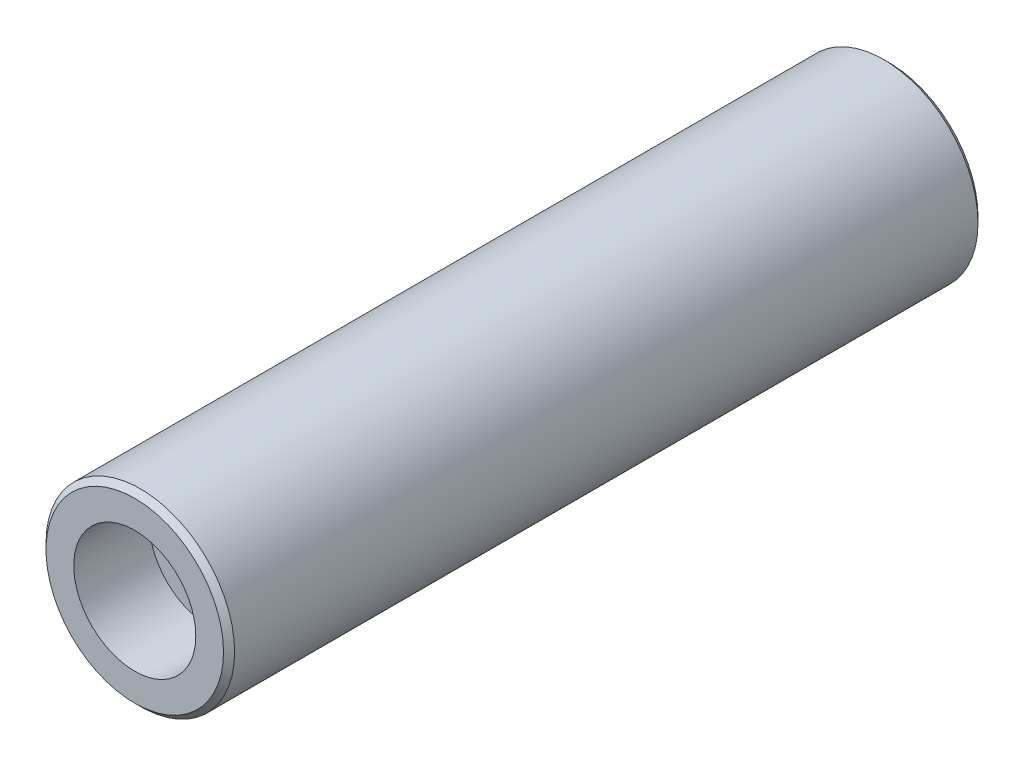
ISO-10303-21;
HEADER;
FILE_DESCRIPTION(('STEP AP214'),'2;1');
FILE_NAME('part.step','',(''),(''),'','','');
FILE_SCHEMA(('AUTOMOTIVE_DESIGN { 1 0 10303 214 1 1 1 1 }'));
ENDSEC;
DATA;
#1=APPLICATION_CONTEXT('core data for automotive mechanical design processes');
#2=APPLICATION_PROTOCOL_DEFINITION('international standard','automotive_design',2000,#1);
#3=PRODUCT_CONTEXT('',#1,'mechanical');
#4=PRODUCT('Part','Part','',(#3));
#5=PRODUCT_RELATED_PRODUCT_CATEGORY('part','',(#4));
#6=PRODUCT_DEFINITION_FORMATION('','',#4);
#7=PRODUCT_DEFINITION_CONTEXT('part definition',#1,'design');
#8=PRODUCT_DEFINITION('design','',#6,#7);
#9=PRODUCT_DEFINITION_SHAPE('','',#8);
#10=(LENGTH_UNIT() NAMED_UNIT(*) SI_UNIT(.MILLI.,.METRE.));
#11=(NAMED_UNIT(*) PLANE_ANGLE_UNIT() SI_UNIT($,.RADIAN.));
#12=(NAMED_UNIT(*) SI_UNIT($,.STERADIAN.) SOLID_ANGLE_UNIT());
#13=UNCERTAINTY_MEASURE_WITH_UNIT(LENGTH_MEASURE(1.E-05),#10,'distance_accuracy_value','');
#14=(GEOMETRIC_REPRESENTATION_CONTEXT(3) GLOBAL_UNCERTAINTY_ASSIGNED_CONTEXT((#13)) GLOBAL_UNIT_ASSIGNED_CONTEXT((#10,
#11,#12)) REPRESENTATION_CONTEXT('',''));
#15=CARTESIAN_POINT('',(0.,0.,0.));
#16=DIRECTION('',(0.,0.,1.));
#17=DIRECTION('',(1.,0.,0.));
#18=AXIS2_PLACEMENT_3D('',#15,#16,#17);
#19=CARTESIAN_POINT('',(-11.7254706962054,-50.937423365936,68.));
#20=DIRECTION('',(0.,0.,-1.));
#21=DIRECTION('',(-1.,0.,0.));
#22=AXIS2_PLACEMENT_3D('',#19,#20,#21);
#23=CYLINDRICAL_SURFACE('',#22,8.5);
#24=CARTESIAN_POINT('',(-11.7254706962054,-50.937423365936,0.499999999999987));
#25=DIRECTION('',(0.,0.,1.));
#26=DIRECTION('',(1.,0.,0.));
#27=AXIS2_PLACEMENT_3D('',#24,#25,#26);
#28=CIRCLE('',#27,8.5);
#29=CARTESIAN_POINT('',(-3.22547069620537,-50.937423365936,0.499999999999987));
#30=VERTEX_POINT('',#29);
#31=EDGE_CURVE('E46',#30,#30,#28,.T.);
#32=ORIENTED_EDGE('',*,*,#31,.T.);
#33=EDGE_LOOP('',(#32));
#34=FACE_BOUND('',#33,.T.);
#35=CARTESIAN_POINT('',(-11.7254706962054,-50.937423365936,67.5));
#36=DIRECTION('',(0.,0.,1.));
#37=DIRECTION('',(1.,0.,0.));
#38=AXIS2_PLACEMENT_3D('',#35,#36,#37);
#39=CIRCLE('',#38,8.5);
#40=CARTESIAN_POINT('',(-3.22547069620537,-50.937423365936,67.5));
#41=VERTEX_POINT('',#40);
#42=EDGE_CURVE('E50',#41,#41,#39,.F.);
#43=ORIENTED_EDGE('',*,*,#42,.T.);
#44=EDGE_LOOP('',(#43));
#45=FACE_BOUND('',#44,.T.);
#46=ADVANCED_FACE('F35',(#34,#45),#23,.T.);
#47=CARTESIAN_POINT('',(-11.7254706962054,-50.937423365936,68.));
#48=DIRECTION('',(0.,0.,1.));
#49=DIRECTION('',(1.,0.,0.));
#50=AXIS2_PLACEMENT_3D('',#47,#48,#49);
#51=PLANE('',#50);
#52=CARTESIAN_POINT('',(-11.7254706962054,-50.937423365936,68.));
#53=DIRECTION('',(0.,0.,1.));
#54=DIRECTION('',(1.,0.,0.));
#55=AXIS2_PLACEMENT_3D('',#52,#53,#54);
#56=CIRCLE('',#55,7.99999999999998);
#57=CARTESIAN_POINT('',(-3.72547069620539,-50.937423365936,68.));
#58=VERTEX_POINT('',#57);
#59=EDGE_CURVE('E10',#58,#58,#56,.T.);
#60=ORIENTED_EDGE('',*,*,#59,.T.);
#61=EDGE_LOOP('',(#60));
#62=FACE_BOUND('',#61,.T.);
#63=CARTESIAN_POINT('',(-11.7254706962057,-50.9374233659371,68.));
#64=DIRECTION('',(0.,0.,1.));
#65=DIRECTION('',(1.,0.,0.));
#66=AXIS2_PLACEMENT_3D('',#63,#64,#65);
#67=CIRCLE('',#66,5.49999999999999);
#68=CARTESIAN_POINT('',(-6.22547069620573,-50.9374233659371,68.));
#69=VERTEX_POINT('',#68);
#70=EDGE_CURVE('E64',#69,#69,#67,.T.);
#71=ORIENTED_EDGE('',*,*,#70,.F.);
#72=EDGE_LOOP('',(#71));
#73=FACE_BOUND('',#72,.T.);
#74=ADVANCED_FACE('F70',(#62,#73),#51,.T.);
#75=CARTESIAN_POINT('',(-11.7254706962054,-50.937423365936,0.));
#76=DIRECTION('',(0.,0.,1.));
#77=DIRECTION('',(1.,0.,0.));
#78=AXIS2_PLACEMENT_3D('',#75,#76,#77);
#79=PLANE('',#78);
#80=CARTESIAN_POINT('',(-11.7254706962054,-50.937423365936,0.));
#81=DIRECTION('',(0.,0.,1.));
#82=DIRECTION('',(1.,0.,0.));
#83=AXIS2_PLACEMENT_3D('',#80,#81,#82);
#84=CIRCLE('',#83,8.00000000000001);
#85=CARTESIAN_POINT('',(-3.72547069620536,-50.937423365936,0.));
#86=VERTEX_POINT('',#85);
#87=EDGE_CURVE('E42',#86,#86,#84,.F.);
#88=ORIENTED_EDGE('',*,*,#87,.T.);
#89=EDGE_LOOP('',(#88));
#90=FACE_BOUND('',#89,.T.);
#91=CARTESIAN_POINT('',(-11.7254706962057,-50.9374233659371,0.));
#92=DIRECTION('',(0.,0.,1.));
#93=DIRECTION('',(1.,0.,0.));
#94=AXIS2_PLACEMENT_3D('',#91,#92,#93);
#95=CIRCLE('',#94,3.49999999999998);
#96=CARTESIAN_POINT('',(-8.22547069620575,-50.9374233659371,0.));
#97=VERTEX_POINT('',#96);
#98=EDGE_CURVE('E55',#97,#97,#95,.T.);
#99=ORIENTED_EDGE('',*,*,#98,.T.);
#100=EDGE_LOOP('',(#99));
#101=FACE_BOUND('',#100,.T.);
#102=ADVANCED_FACE('F72',(#90,#101),#79,.F.);
#103=CARTESIAN_POINT('',(-11.7254706962057,-50.9374233659371,68.));
#104=DIRECTION('',(0.,0.,1.));
#105=DIRECTION('',(1.,0.,0.));
#106=AXIS2_PLACEMENT_3D('',#103,#104,#105);
#107=CYLINDRICAL_SURFACE('',#106,3.49999999999999);
#108=ORIENTED_EDGE('',*,*,#98,.F.);
#109=EDGE_LOOP('',(#108));
#110=FACE_BOUND('',#109,.T.);
#111=CARTESIAN_POINT('',(-11.7254706962057,-50.9374233659371,61.2));
#112=DIRECTION('',(0.,0.,1.));
#113=DIRECTION('',(1.,0.,0.));
#114=AXIS2_PLACEMENT_3D('',#111,#112,#113);
#115=CIRCLE('',#114,3.5);
#116=CARTESIAN_POINT('',(-8.22547069620572,-50.9374233659371,61.2));
#117=VERTEX_POINT('',#116);
#118=EDGE_CURVE('E58',#117,#117,#115,.T.);
#119=ORIENTED_EDGE('',*,*,#118,.T.);
#120=EDGE_LOOP('',(#119));
#121=FACE_BOUND('',#120,.T.);
#122=ADVANCED_FACE('F78',(#110,#121),#107,.F.);
#123=CARTESIAN_POINT('',(-8.22547069620572,-50.9374233659371,61.2));
#124=DIRECTION('',(0.,0.,-1.));
#125=DIRECTION('',(-1.,0.,0.));
#126=AXIS2_PLACEMENT_3D('',#123,#124,#125);
#127=PLANE('',#126);
#128=ORIENTED_EDGE('',*,*,#118,.F.);
#129=EDGE_LOOP('',(#128));
#130=FACE_BOUND('',#129,.T.);
#131=CARTESIAN_POINT('',(-11.7254706962057,-50.9374233659371,61.2));
#132=DIRECTION('',(0.,0.,1.));
#133=DIRECTION('',(1.,0.,0.));
#134=AXIS2_PLACEMENT_3D('',#131,#132,#133);
#135=CIRCLE('',#134,5.5);
#136=CARTESIAN_POINT('',(-6.22547069620573,-50.9374233659371,61.2));
#137=VERTEX_POINT('',#136);
#138=EDGE_CURVE('E61',#137,#137,#135,.T.);
#139=ORIENTED_EDGE('',*,*,#138,.T.);
#140=EDGE_LOOP('',(#139));
#141=FACE_BOUND('',#140,.T.);
#142=ADVANCED_FACE('F92',(#130,#141),#127,.F.);
#143=CARTESIAN_POINT('',(-11.7254706962057,-50.9374233659371,68.));
#144=DIRECTION('',(0.,0.,1.));
#145=DIRECTION('',(1.,0.,0.));
#146=AXIS2_PLACEMENT_3D('',#143,#144,#145);
#147=CYLINDRICAL_SURFACE('',#146,5.5);
#148=ORIENTED_EDGE('',*,*,#138,.F.);
#149=EDGE_LOOP('',(#148));
#150=FACE_BOUND('',#149,.T.);
#151=ORIENTED_EDGE('',*,*,#70,.T.);
#152=EDGE_LOOP('',(#151));
#153=FACE_BOUND('',#152,.T.);
#154=ADVANCED_FACE('F68',(#150,#153),#147,.F.);
#155=CARTESIAN_POINT('',(-11.7254706962054,-50.937423365936,0.499999999999987));
#156=DIRECTION('',(0.,0.,1.));
#157=DIRECTION('',(1.,0.,0.));
#158=AXIS2_PLACEMENT_3D('',#155,#156,#157);
#159=CONICAL_SURFACE('',#158,8.5,0.785398163397455);
#160=ORIENTED_EDGE('',*,*,#87,.F.);
#161=EDGE_LOOP('',(#160));
#162=FACE_BOUND('',#161,.T.);
#163=ORIENTED_EDGE('',*,*,#31,.F.);
#164=EDGE_LOOP('',(#163));
#165=FACE_BOUND('',#164,.T.);
#166=ADVANCED_FACE('F84',(#162,#165),#159,.T.);
#167=CARTESIAN_POINT('',(-11.7254706962054,-50.937423365936,68.));
#168=DIRECTION('',(0.,0.,-1.));
#169=DIRECTION('',(-1.,0.,0.));
#170=AXIS2_PLACEMENT_3D('',#167,#168,#169);
#171=CONICAL_SURFACE('',#170,7.99999999999998,0.785398163397441);
#172=ORIENTED_EDGE('',*,*,#42,.F.);
#173=EDGE_LOOP('',(#172));
#174=FACE_BOUND('',#173,.T.);
#175=ORIENTED_EDGE('',*,*,#59,.F.);
#176=EDGE_LOOP('',(#175));
#177=FACE_BOUND('',#176,.T.);
#178=ADVANCED_FACE('F37',(#174,#177),#171,.T.);
#179=CLOSED_SHELL('',(#46,#74,#102,#122,#142,#154,#166,#178));
#180=MANIFOLD_SOLID_BREP('B2',#179);
#181=ADVANCED_BREP_SHAPE_REPRESENTATION('',(#18,#180),#14);
#182=SHAPE_DEFINITION_REPRESENTATION(#9,#181);
ENDSEC;
END-ISO-10303-21;
